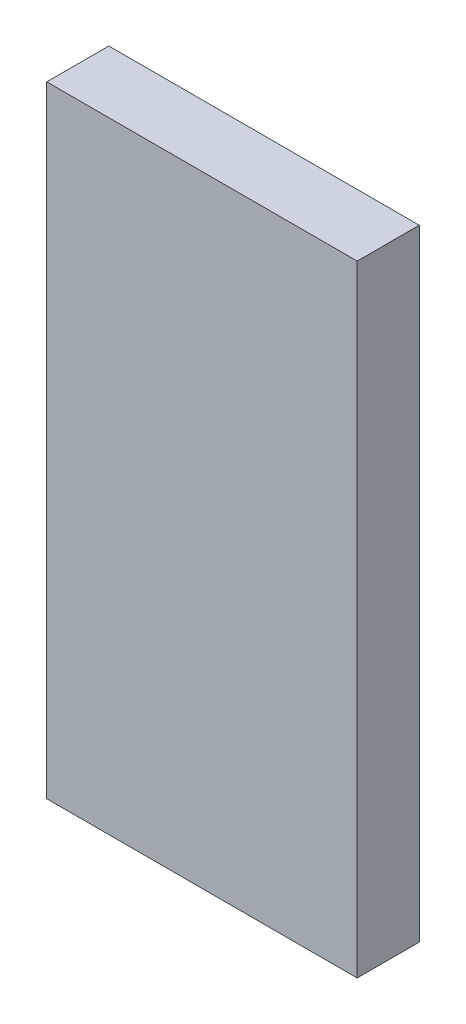
ISO-10303-21;
HEADER;
FILE_DESCRIPTION(('STEP AP214'),'2;1');
FILE_NAME('part.step','',(''),(''),'','','');
FILE_SCHEMA(('AUTOMOTIVE_DESIGN { 1 0 10303 214 1 1 1 1 }'));
ENDSEC;
DATA;
#1=APPLICATION_CONTEXT('core data for automotive mechanical design processes');
#2=APPLICATION_PROTOCOL_DEFINITION('international standard','automotive_design',2000,#1);
#3=PRODUCT_CONTEXT('',#1,'mechanical');
#4=PRODUCT('Part','Part','',(#3));
#5=PRODUCT_RELATED_PRODUCT_CATEGORY('part','',(#4));
#6=PRODUCT_DEFINITION_FORMATION('','',#4);
#7=PRODUCT_DEFINITION_CONTEXT('part definition',#1,'design');
#8=PRODUCT_DEFINITION('design','',#6,#7);
#9=PRODUCT_DEFINITION_SHAPE('','',#8);
#10=(LENGTH_UNIT() NAMED_UNIT(*) SI_UNIT(.MILLI.,.METRE.));
#11=(NAMED_UNIT(*) PLANE_ANGLE_UNIT() SI_UNIT($,.RADIAN.));
#12=(NAMED_UNIT(*) SI_UNIT($,.STERADIAN.) SOLID_ANGLE_UNIT());
#13=UNCERTAINTY_MEASURE_WITH_UNIT(LENGTH_MEASURE(1.E-05),#10,'distance_accuracy_value','');
#14=(GEOMETRIC_REPRESENTATION_CONTEXT(3) GLOBAL_UNCERTAINTY_ASSIGNED_CONTEXT((#13)) GLOBAL_UNIT_ASSIGNED_CONTEXT((#10,
#11,#12)) REPRESENTATION_CONTEXT('',''));
#15=CARTESIAN_POINT('',(0.,0.,0.));
#16=DIRECTION('',(0.,0.,1.));
#17=DIRECTION('',(1.,0.,0.));
#18=AXIS2_PLACEMENT_3D('',#15,#16,#17);
#19=CARTESIAN_POINT('',(-30.,-60.,12.));
#20=DIRECTION('',(1.,0.,0.));
#21=DIRECTION('',(0.,0.,-1.));
#22=AXIS2_PLACEMENT_3D('',#19,#20,#21);
#23=PLANE('',#22);
#24=DIRECTION('',(0.,-1.,0.));
#25=VECTOR('',#24,1.);
#26=CARTESIAN_POINT('',(-30.,-60.,0.));
#27=LINE('',#26,#25);
#28=CARTESIAN_POINT('',(-30.,60.,0.));
#29=VERTEX_POINT('',#28);
#30=CARTESIAN_POINT('',(-30.,-60.,0.));
#31=VERTEX_POINT('',#30);
#32=EDGE_CURVE('E107',#29,#31,#27,.T.);
#33=ORIENTED_EDGE('',*,*,#32,.T.);
#34=DIRECTION('',(0.,0.,-1.));
#35=VECTOR('',#34,1.);
#36=CARTESIAN_POINT('',(-30.,-60.,12.));
#37=LINE('',#36,#35);
#38=CARTESIAN_POINT('',(-30.,-60.,12.));
#39=VERTEX_POINT('',#38);
#40=EDGE_CURVE('E11',#39,#31,#37,.T.);
#41=ORIENTED_EDGE('',*,*,#40,.F.);
#42=DIRECTION('',(0.,-1.,0.));
#43=VECTOR('',#42,1.);
#44=CARTESIAN_POINT('',(-30.,-60.,12.));
#45=LINE('',#44,#43);
#46=CARTESIAN_POINT('',(-30.,60.,12.));
#47=VERTEX_POINT('',#46);
#48=EDGE_CURVE('E91',#47,#39,#45,.T.);
#49=ORIENTED_EDGE('',*,*,#48,.F.);
#50=DIRECTION('',(0.,0.,-1.));
#51=VECTOR('',#50,1.);
#52=CARTESIAN_POINT('',(-30.,60.,12.));
#53=LINE('',#52,#51);
#54=EDGE_CURVE('E103',#47,#29,#53,.T.);
#55=ORIENTED_EDGE('',*,*,#54,.T.);
#56=EDGE_LOOP('',(#33,#41,#49,#55));
#57=FACE_BOUND('',#56,.T.);
#58=ADVANCED_FACE('F39',(#57),#23,.F.);
#59=CARTESIAN_POINT('',(30.,-60.,12.));
#60=DIRECTION('',(0.,1.,0.));
#61=DIRECTION('',(0.,0.,1.));
#62=AXIS2_PLACEMENT_3D('',#59,#60,#61);
#63=PLANE('',#62);
#64=DIRECTION('',(1.,0.,0.));
#65=VECTOR('',#64,1.);
#66=CARTESIAN_POINT('',(30.,-60.,0.));
#67=LINE('',#66,#65);
#68=CARTESIAN_POINT('',(30.,-60.,0.));
#69=VERTEX_POINT('',#68);
#70=EDGE_CURVE('E96',#31,#69,#67,.T.);
#71=ORIENTED_EDGE('',*,*,#70,.T.);
#72=DIRECTION('',(0.,0.,-1.));
#73=VECTOR('',#72,1.);
#74=CARTESIAN_POINT('',(30.,-60.,12.));
#75=LINE('',#74,#73);
#76=CARTESIAN_POINT('',(30.,-60.,12.));
#77=VERTEX_POINT('',#76);
#78=EDGE_CURVE('E48',#77,#69,#75,.T.);
#79=ORIENTED_EDGE('',*,*,#78,.F.);
#80=DIRECTION('',(1.,0.,0.));
#81=VECTOR('',#80,1.);
#82=CARTESIAN_POINT('',(30.,-60.,12.));
#83=LINE('',#82,#81);
#84=EDGE_CURVE('E86',#39,#77,#83,.T.);
#85=ORIENTED_EDGE('',*,*,#84,.F.);
#86=ORIENTED_EDGE('',*,*,#40,.T.);
#87=EDGE_LOOP('',(#71,#79,#85,#86));
#88=FACE_BOUND('',#87,.T.);
#89=ADVANCED_FACE('F95',(#88),#63,.F.);
#90=CARTESIAN_POINT('',(30.,-60.,12.));
#91=DIRECTION('',(-1.,0.,0.));
#92=DIRECTION('',(0.,0.,1.));
#93=AXIS2_PLACEMENT_3D('',#90,#91,#92);
#94=PLANE('',#93);
#95=DIRECTION('',(0.,1.,0.));
#96=VECTOR('',#95,1.);
#97=CARTESIAN_POINT('',(30.,-60.,0.));
#98=LINE('',#97,#96);
#99=CARTESIAN_POINT('',(30.,60.,0.));
#100=VERTEX_POINT('',#99);
#101=EDGE_CURVE('E73',#69,#100,#98,.T.);
#102=ORIENTED_EDGE('',*,*,#101,.T.);
#103=DIRECTION('',(0.,0.,-1.));
#104=VECTOR('',#103,1.);
#105=CARTESIAN_POINT('',(30.,60.,12.));
#106=LINE('',#105,#104);
#107=CARTESIAN_POINT('',(30.,60.,12.));
#108=VERTEX_POINT('',#107);
#109=EDGE_CURVE('E98',#108,#100,#106,.T.);
#110=ORIENTED_EDGE('',*,*,#109,.F.);
#111=DIRECTION('',(0.,1.,0.));
#112=VECTOR('',#111,1.);
#113=CARTESIAN_POINT('',(30.,-60.,12.));
#114=LINE('',#113,#112);
#115=EDGE_CURVE('E89',#77,#108,#114,.T.);
#116=ORIENTED_EDGE('',*,*,#115,.F.);
#117=ORIENTED_EDGE('',*,*,#78,.T.);
#118=EDGE_LOOP('',(#102,#110,#116,#117));
#119=FACE_BOUND('',#118,.T.);
#120=ADVANCED_FACE('F99',(#119),#94,.F.);
#121=CARTESIAN_POINT('',(30.,60.,12.));
#122=DIRECTION('',(0.,-1.,0.));
#123=DIRECTION('',(1.,0.,0.));
#124=AXIS2_PLACEMENT_3D('',#121,#122,#123);
#125=PLANE('',#124);
#126=DIRECTION('',(-1.,0.,0.));
#127=VECTOR('',#126,1.);
#128=CARTESIAN_POINT('',(30.,60.,0.));
#129=LINE('',#128,#127);
#130=EDGE_CURVE('E79',#100,#29,#129,.T.);
#131=ORIENTED_EDGE('',*,*,#130,.T.);
#132=ORIENTED_EDGE('',*,*,#54,.F.);
#133=DIRECTION('',(-1.,0.,0.));
#134=VECTOR('',#133,1.);
#135=CARTESIAN_POINT('',(30.,60.,12.));
#136=LINE('',#135,#134);
#137=EDGE_CURVE('E56',#108,#47,#136,.T.);
#138=ORIENTED_EDGE('',*,*,#137,.F.);
#139=ORIENTED_EDGE('',*,*,#109,.T.);
#140=EDGE_LOOP('',(#131,#132,#138,#139));
#141=FACE_BOUND('',#140,.T.);
#142=ADVANCED_FACE('F120',(#141),#125,.F.);
#143=CARTESIAN_POINT('',(0.,0.,12.));
#144=DIRECTION('',(0.,0.,1.));
#145=DIRECTION('',(1.,0.,0.));
#146=AXIS2_PLACEMENT_3D('',#143,#144,#145);
#147=PLANE('',#146);
#148=ORIENTED_EDGE('',*,*,#48,.T.);
#149=ORIENTED_EDGE('',*,*,#84,.T.);
#150=ORIENTED_EDGE('',*,*,#115,.T.);
#151=ORIENTED_EDGE('',*,*,#137,.T.);
#152=EDGE_LOOP('',(#148,#149,#150,#151));
#153=FACE_BOUND('',#152,.T.);
#154=ADVANCED_FACE('F87',(#153),#147,.T.);
#155=CARTESIAN_POINT('',(0.,0.,0.));
#156=DIRECTION('',(0.,0.,1.));
#157=DIRECTION('',(1.,0.,0.));
#158=AXIS2_PLACEMENT_3D('',#155,#156,#157);
#159=PLANE('',#158);
#160=ORIENTED_EDGE('',*,*,#32,.F.);
#161=ORIENTED_EDGE('',*,*,#130,.F.);
#162=ORIENTED_EDGE('',*,*,#101,.F.);
#163=ORIENTED_EDGE('',*,*,#70,.F.);
#164=EDGE_LOOP('',(#160,#161,#162,#163));
#165=FACE_BOUND('',#164,.T.);
#166=ADVANCED_FACE('F123',(#165),#159,.F.);
#167=CLOSED_SHELL('',(#58,#89,#120,#142,#154,#166));
#168=MANIFOLD_SOLID_BREP('B2',#167);
#169=ADVANCED_BREP_SHAPE_REPRESENTATION('',(#18,#168),#14);
#170=SHAPE_DEFINITION_REPRESENTATION(#9,#169);
ENDSEC;
END-ISO-10303-21;
